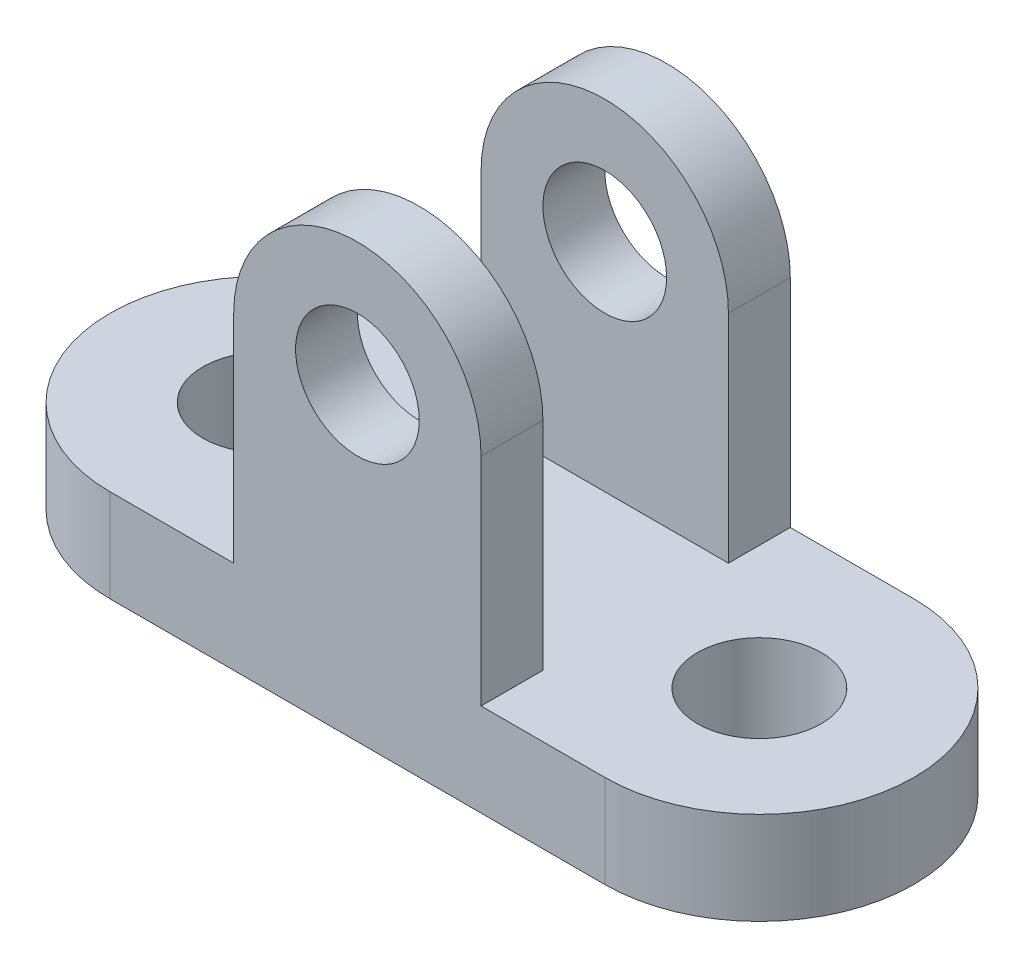
ISO-10303-21;
HEADER;
FILE_DESCRIPTION(('STEP AP214'),'2;1');
FILE_NAME('part.step','',(''),(''),'','','');
FILE_SCHEMA(('AUTOMOTIVE_DESIGN { 1 0 10303 214 1 1 1 1 }'));
ENDSEC;
DATA;
#1=APPLICATION_CONTEXT('core data for automotive mechanical design processes');
#2=APPLICATION_PROTOCOL_DEFINITION('international standard','automotive_design',2000,#1);
#3=PRODUCT_CONTEXT('',#1,'mechanical');
#4=PRODUCT('Part','Part','',(#3));
#5=PRODUCT_RELATED_PRODUCT_CATEGORY('part','',(#4));
#6=PRODUCT_DEFINITION_FORMATION('','',#4);
#7=PRODUCT_DEFINITION_CONTEXT('part definition',#1,'design');
#8=PRODUCT_DEFINITION('design','',#6,#7);
#9=PRODUCT_DEFINITION_SHAPE('','',#8);
#10=(LENGTH_UNIT() NAMED_UNIT(*) SI_UNIT(.MILLI.,.METRE.));
#11=(NAMED_UNIT(*) PLANE_ANGLE_UNIT() SI_UNIT($,.RADIAN.));
#12=(NAMED_UNIT(*) SI_UNIT($,.STERADIAN.) SOLID_ANGLE_UNIT());
#13=UNCERTAINTY_MEASURE_WITH_UNIT(LENGTH_MEASURE(1.E-05),#10,'distance_accuracy_value','');
#14=(GEOMETRIC_REPRESENTATION_CONTEXT(3) GLOBAL_UNCERTAINTY_ASSIGNED_CONTEXT((#13)) GLOBAL_UNIT_ASSIGNED_CONTEXT((#10,
#11,#12)) REPRESENTATION_CONTEXT('',''));
#15=CARTESIAN_POINT('',(0.,0.,0.));
#16=DIRECTION('',(0.,0.,1.));
#17=DIRECTION('',(1.,0.,0.));
#18=AXIS2_PLACEMENT_3D('',#15,#16,#17);
#19=CARTESIAN_POINT('',(-40.,15.,0.));
#20=DIRECTION('',(0.,1.,0.));
#21=DIRECTION('',(0.,0.,1.));
#22=AXIS2_PLACEMENT_3D('',#19,#20,#21);
#23=PLANE('',#22);
#24=DIRECTION('',(0.,0.,1.));
#25=VECTOR('',#24,1.);
#26=CARTESIAN_POINT('',(-20.,15.,-25.));
#27=LINE('',#26,#25);
#28=CARTESIAN_POINT('',(-20.,15.,-25.));
#29=VERTEX_POINT('',#28);
#30=CARTESIAN_POINT('',(-20.,15.,-15.));
#31=VERTEX_POINT('',#30);
#32=EDGE_CURVE('E141',#29,#31,#27,.T.);
#33=ORIENTED_EDGE('',*,*,#32,.F.);
#34=DIRECTION('',(-1.,0.,0.));
#35=VECTOR('',#34,1.);
#36=CARTESIAN_POINT('',(-40.,15.,-25.));
#37=LINE('',#36,#35);
#38=CARTESIAN_POINT('',(-40.,15.,-25.));
#39=VERTEX_POINT('',#38);
#40=EDGE_CURVE('E127',#29,#39,#37,.T.);
#41=ORIENTED_EDGE('',*,*,#40,.T.);
#42=CARTESIAN_POINT('',(-40.,15.,0.));
#43=DIRECTION('',(0.,1.,0.));
#44=DIRECTION('',(0.,0.,1.));
#45=AXIS2_PLACEMENT_3D('',#42,#43,#44);
#46=CIRCLE('',#45,25.);
#47=CARTESIAN_POINT('',(-40.,15.,25.));
#48=VERTEX_POINT('',#47);
#49=EDGE_CURVE('E220',#39,#48,#46,.T.);
#50=ORIENTED_EDGE('',*,*,#49,.T.);
#51=DIRECTION('',(1.,0.,0.));
#52=VECTOR('',#51,1.);
#53=CARTESIAN_POINT('',(-40.,15.,25.));
#54=LINE('',#53,#52);
#55=CARTESIAN_POINT('',(-20.,15.,25.));
#56=VERTEX_POINT('',#55);
#57=EDGE_CURVE('E224',#48,#56,#54,.T.);
#58=ORIENTED_EDGE('',*,*,#57,.T.);
#59=DIRECTION('',(0.,0.,-1.));
#60=VECTOR('',#59,1.);
#61=CARTESIAN_POINT('',(-20.,15.,25.));
#62=LINE('',#61,#60);
#63=CARTESIAN_POINT('',(-20.,15.,15.));
#64=VERTEX_POINT('',#63);
#65=EDGE_CURVE('E187',#56,#64,#62,.T.);
#66=ORIENTED_EDGE('',*,*,#65,.T.);
#67=DIRECTION('',(1.,0.,0.));
#68=VECTOR('',#67,1.);
#69=CARTESIAN_POINT('',(-20.,15.,15.));
#70=LINE('',#69,#68);
#71=CARTESIAN_POINT('',(20.,15.,15.));
#72=VERTEX_POINT('',#71);
#73=EDGE_CURVE('E177',#64,#72,#70,.T.);
#74=ORIENTED_EDGE('',*,*,#73,.T.);
#75=DIRECTION('',(0.,0.,-1.));
#76=VECTOR('',#75,1.);
#77=CARTESIAN_POINT('',(20.,15.,25.));
#78=LINE('',#77,#76);
#79=CARTESIAN_POINT('',(20.,15.,25.));
#80=VERTEX_POINT('',#79);
#81=EDGE_CURVE('E204',#80,#72,#78,.T.);
#82=ORIENTED_EDGE('',*,*,#81,.F.);
#83=CARTESIAN_POINT('',(40.,15.,25.));
#84=VERTEX_POINT('',#83);
#85=EDGE_CURVE('E222',#80,#84,#54,.T.);
#86=ORIENTED_EDGE('',*,*,#85,.T.);
#87=CARTESIAN_POINT('',(40.,15.,0.));
#88=DIRECTION('',(0.,1.,0.));
#89=DIRECTION('',(0.,0.,1.));
#90=AXIS2_PLACEMENT_3D('',#87,#88,#89);
#91=CIRCLE('',#90,25.);
#92=CARTESIAN_POINT('',(40.,15.,-25.));
#93=VERTEX_POINT('',#92);
#94=EDGE_CURVE('E139',#84,#93,#91,.T.);
#95=ORIENTED_EDGE('',*,*,#94,.T.);
#96=CARTESIAN_POINT('',(20.,15.,-25.));
#97=VERTEX_POINT('',#96);
#98=EDGE_CURVE('E138',#93,#97,#37,.T.);
#99=ORIENTED_EDGE('',*,*,#98,.T.);
#100=DIRECTION('',(0.,0.,1.));
#101=VECTOR('',#100,1.);
#102=CARTESIAN_POINT('',(20.,15.,-25.));
#103=LINE('',#102,#101);
#104=CARTESIAN_POINT('',(20.,15.,-15.));
#105=VERTEX_POINT('',#104);
#106=EDGE_CURVE('E54',#97,#105,#103,.T.);
#107=ORIENTED_EDGE('',*,*,#106,.T.);
#108=DIRECTION('',(1.,0.,0.));
#109=VECTOR('',#108,1.);
#110=CARTESIAN_POINT('',(-20.,15.,-15.));
#111=LINE('',#110,#109);
#112=EDGE_CURVE('E58',#31,#105,#111,.T.);
#113=ORIENTED_EDGE('',*,*,#112,.F.);
#114=EDGE_LOOP('',(#33,#41,#50,#58,#66,#74,#82,#86,#95,#99,#107,#113));
#115=FACE_BOUND('',#114,.T.);
#116=CARTESIAN_POINT('',(-40.,15.,0.));
#117=DIRECTION('',(0.,1.,0.));
#118=DIRECTION('',(0.,0.,1.));
#119=AXIS2_PLACEMENT_3D('',#116,#117,#118);
#120=CIRCLE('',#119,10.);
#121=CARTESIAN_POINT('',(-40.,15.,10.));
#122=VERTEX_POINT('',#121);
#123=EDGE_CURVE('E214',#122,#122,#120,.T.);
#124=ORIENTED_EDGE('',*,*,#123,.F.);
#125=EDGE_LOOP('',(#124));
#126=FACE_BOUND('',#125,.T.);
#127=CARTESIAN_POINT('',(40.,15.,0.));
#128=DIRECTION('',(0.,1.,0.));
#129=DIRECTION('',(0.,0.,1.));
#130=AXIS2_PLACEMENT_3D('',#127,#128,#129);
#131=CIRCLE('',#130,10.);
#132=CARTESIAN_POINT('',(40.,15.,9.99999999999999));
#133=VERTEX_POINT('',#132);
#134=EDGE_CURVE('E208',#133,#133,#131,.T.);
#135=ORIENTED_EDGE('',*,*,#134,.F.);
#136=EDGE_LOOP('',(#135));
#137=FACE_BOUND('',#136,.T.);
#138=ADVANCED_FACE('F39',(#115,#126,#137),#23,.T.);
#139=CARTESIAN_POINT('',(-40.,0.,0.));
#140=DIRECTION('',(0.,1.,0.));
#141=DIRECTION('',(0.,0.,1.));
#142=AXIS2_PLACEMENT_3D('',#139,#140,#141);
#143=PLANE('',#142);
#144=CARTESIAN_POINT('',(-40.,0.,0.));
#145=DIRECTION('',(0.,1.,0.));
#146=DIRECTION('',(0.,0.,1.));
#147=AXIS2_PLACEMENT_3D('',#144,#145,#146);
#148=CIRCLE('',#147,25.);
#149=CARTESIAN_POINT('',(-40.,0.,-25.));
#150=VERTEX_POINT('',#149);
#151=CARTESIAN_POINT('',(-40.,0.,25.));
#152=VERTEX_POINT('',#151);
#153=EDGE_CURVE('E217',#150,#152,#148,.T.);
#154=ORIENTED_EDGE('',*,*,#153,.F.);
#155=DIRECTION('',(-1.,0.,0.));
#156=VECTOR('',#155,1.);
#157=CARTESIAN_POINT('',(-40.,0.,-25.));
#158=LINE('',#157,#156);
#159=CARTESIAN_POINT('',(40.,0.,-25.));
#160=VERTEX_POINT('',#159);
#161=EDGE_CURVE('E223',#160,#150,#158,.T.);
#162=ORIENTED_EDGE('',*,*,#161,.F.);
#163=CARTESIAN_POINT('',(40.,0.,0.));
#164=DIRECTION('',(0.,1.,0.));
#165=DIRECTION('',(0.,0.,1.));
#166=AXIS2_PLACEMENT_3D('',#163,#164,#165);
#167=CIRCLE('',#166,25.);
#168=CARTESIAN_POINT('',(40.,0.,25.));
#169=VERTEX_POINT('',#168);
#170=EDGE_CURVE('E232',#169,#160,#167,.T.);
#171=ORIENTED_EDGE('',*,*,#170,.F.);
#172=DIRECTION('',(1.,0.,0.));
#173=VECTOR('',#172,1.);
#174=CARTESIAN_POINT('',(-40.,0.,25.));
#175=LINE('',#174,#173);
#176=EDGE_CURVE('E230',#152,#169,#175,.T.);
#177=ORIENTED_EDGE('',*,*,#176,.F.);
#178=EDGE_LOOP('',(#154,#162,#171,#177));
#179=FACE_BOUND('',#178,.T.);
#180=CARTESIAN_POINT('',(-40.,0.,0.));
#181=DIRECTION('',(0.,1.,0.));
#182=DIRECTION('',(0.,0.,1.));
#183=AXIS2_PLACEMENT_3D('',#180,#181,#182);
#184=CIRCLE('',#183,10.);
#185=CARTESIAN_POINT('',(-40.,0.,10.));
#186=VERTEX_POINT('',#185);
#187=EDGE_CURVE('E211',#186,#186,#184,.T.);
#188=ORIENTED_EDGE('',*,*,#187,.T.);
#189=EDGE_LOOP('',(#188));
#190=FACE_BOUND('',#189,.T.);
#191=CARTESIAN_POINT('',(40.,0.,0.));
#192=DIRECTION('',(0.,1.,0.));
#193=DIRECTION('',(0.,0.,1.));
#194=AXIS2_PLACEMENT_3D('',#191,#192,#193);
#195=CIRCLE('',#194,10.);
#196=CARTESIAN_POINT('',(40.,0.,9.99999999999999));
#197=VERTEX_POINT('',#196);
#198=EDGE_CURVE('E207',#197,#197,#195,.T.);
#199=ORIENTED_EDGE('',*,*,#198,.T.);
#200=EDGE_LOOP('',(#199));
#201=FACE_BOUND('',#200,.T.);
#202=ADVANCED_FACE('F250',(#179,#190,#201),#143,.F.);
#203=CARTESIAN_POINT('',(-40.,15.,0.));
#204=DIRECTION('',(0.,-1.,0.));
#205=DIRECTION('',(0.,0.,-1.));
#206=AXIS2_PLACEMENT_3D('',#203,#204,#205);
#207=CYLINDRICAL_SURFACE('',#206,25.);
#208=ORIENTED_EDGE('',*,*,#153,.T.);
#209=DIRECTION('',(0.,-1.,0.));
#210=VECTOR('',#209,1.);
#211=CARTESIAN_POINT('',(-40.,15.,25.));
#212=LINE('',#211,#210);
#213=EDGE_CURVE('E11',#48,#152,#212,.T.);
#214=ORIENTED_EDGE('',*,*,#213,.F.);
#215=ORIENTED_EDGE('',*,*,#49,.F.);
#216=DIRECTION('',(0.,-1.,0.));
#217=VECTOR('',#216,1.);
#218=CARTESIAN_POINT('',(-40.,15.,-25.));
#219=LINE('',#218,#217);
#220=EDGE_CURVE('E135',#39,#150,#219,.T.);
#221=ORIENTED_EDGE('',*,*,#220,.T.);
#222=EDGE_LOOP('',(#208,#214,#215,#221));
#223=FACE_BOUND('',#222,.T.);
#224=ADVANCED_FACE('F41',(#223),#207,.T.);
#225=CARTESIAN_POINT('',(-40.,15.,25.));
#226=DIRECTION('',(0.,0.,-1.));
#227=DIRECTION('',(-1.,0.,0.));
#228=AXIS2_PLACEMENT_3D('',#225,#226,#227);
#229=PLANE('',#228);
#230=ORIENTED_EDGE('',*,*,#176,.T.);
#231=DIRECTION('',(0.,-1.,0.));
#232=VECTOR('',#231,1.);
#233=CARTESIAN_POINT('',(40.,15.,25.));
#234=LINE('',#233,#232);
#235=EDGE_CURVE('E47',#84,#169,#234,.T.);
#236=ORIENTED_EDGE('',*,*,#235,.F.);
#237=ORIENTED_EDGE('',*,*,#85,.F.);
#238=DIRECTION('',(0.,1.,0.));
#239=VECTOR('',#238,1.);
#240=CARTESIAN_POINT('',(20.,50.,25.));
#241=LINE('',#240,#239);
#242=CARTESIAN_POINT('',(20.,50.,25.));
#243=VERTEX_POINT('',#242);
#244=EDGE_CURVE('E180',#80,#243,#241,.T.);
#245=ORIENTED_EDGE('',*,*,#244,.T.);
#246=CARTESIAN_POINT('',(0.,50.,25.));
#247=DIRECTION('',(0.,0.,1.));
#248=DIRECTION('',(-1.,0.,0.));
#249=AXIS2_PLACEMENT_3D('',#246,#247,#248);
#250=CIRCLE('',#249,20.);
#251=CARTESIAN_POINT('',(-20.,50.,25.));
#252=VERTEX_POINT('',#251);
#253=EDGE_CURVE('E182',#243,#252,#250,.T.);
#254=ORIENTED_EDGE('',*,*,#253,.T.);
#255=DIRECTION('',(0.,-1.,0.));
#256=VECTOR('',#255,1.);
#257=CARTESIAN_POINT('',(-20.,15.,25.));
#258=LINE('',#257,#256);
#259=EDGE_CURVE('E185',#252,#56,#258,.T.);
#260=ORIENTED_EDGE('',*,*,#259,.T.);
#261=ORIENTED_EDGE('',*,*,#57,.F.);
#262=ORIENTED_EDGE('',*,*,#213,.T.);
#263=EDGE_LOOP('',(#230,#236,#237,#245,#254,#260,#261,#262));
#264=FACE_BOUND('',#263,.T.);
#265=CARTESIAN_POINT('',(0.,50.,25.));
#266=DIRECTION('',(0.,0.,1.));
#267=DIRECTION('',(1.,0.,0.));
#268=AXIS2_PLACEMENT_3D('',#265,#266,#267);
#269=CIRCLE('',#268,10.);
#270=CARTESIAN_POINT('',(10.,50.,25.));
#271=VERTEX_POINT('',#270);
#272=EDGE_CURVE('E174',#271,#271,#269,.T.);
#273=ORIENTED_EDGE('',*,*,#272,.F.);
#274=EDGE_LOOP('',(#273));
#275=FACE_BOUND('',#274,.T.);
#276=ADVANCED_FACE('F256',(#264,#275),#229,.F.);
#277=CARTESIAN_POINT('',(40.,15.,0.));
#278=DIRECTION('',(0.,-1.,0.));
#279=DIRECTION('',(0.,0.,-1.));
#280=AXIS2_PLACEMENT_3D('',#277,#278,#279);
#281=CYLINDRICAL_SURFACE('',#280,25.);
#282=ORIENTED_EDGE('',*,*,#170,.T.);
#283=DIRECTION('',(0.,-1.,0.));
#284=VECTOR('',#283,1.);
#285=CARTESIAN_POINT('',(40.,15.,-25.));
#286=LINE('',#285,#284);
#287=EDGE_CURVE('E236',#93,#160,#286,.T.);
#288=ORIENTED_EDGE('',*,*,#287,.F.);
#289=ORIENTED_EDGE('',*,*,#94,.F.);
#290=ORIENTED_EDGE('',*,*,#235,.T.);
#291=EDGE_LOOP('',(#282,#288,#289,#290));
#292=FACE_BOUND('',#291,.T.);
#293=ADVANCED_FACE('F243',(#292),#281,.T.);
#294=CARTESIAN_POINT('',(-40.,15.,-25.));
#295=DIRECTION('',(0.,0.,1.));
#296=DIRECTION('',(1.,0.,0.));
#297=AXIS2_PLACEMENT_3D('',#294,#295,#296);
#298=PLANE('',#297);
#299=ORIENTED_EDGE('',*,*,#161,.T.);
#300=ORIENTED_EDGE('',*,*,#220,.F.);
#301=ORIENTED_EDGE('',*,*,#40,.F.);
#302=DIRECTION('',(0.,-1.,0.));
#303=VECTOR('',#302,1.);
#304=CARTESIAN_POINT('',(-20.,15.,-25.));
#305=LINE('',#304,#303);
#306=CARTESIAN_POINT('',(-20.,50.,-25.));
#307=VERTEX_POINT('',#306);
#308=EDGE_CURVE('E132',#307,#29,#305,.T.);
#309=ORIENTED_EDGE('',*,*,#308,.F.);
#310=CARTESIAN_POINT('',(0.,50.,-25.));
#311=DIRECTION('',(0.,0.,1.));
#312=DIRECTION('',(-1.,0.,0.));
#313=AXIS2_PLACEMENT_3D('',#310,#311,#312);
#314=CIRCLE('',#313,20.);
#315=CARTESIAN_POINT('',(20.,50.,-25.));
#316=VERTEX_POINT('',#315);
#317=EDGE_CURVE('E150',#316,#307,#314,.T.);
#318=ORIENTED_EDGE('',*,*,#317,.F.);
#319=DIRECTION('',(0.,1.,0.));
#320=VECTOR('',#319,1.);
#321=CARTESIAN_POINT('',(20.,50.,-25.));
#322=LINE('',#321,#320);
#323=EDGE_CURVE('E153',#97,#316,#322,.T.);
#324=ORIENTED_EDGE('',*,*,#323,.F.);
#325=ORIENTED_EDGE('',*,*,#98,.F.);
#326=ORIENTED_EDGE('',*,*,#287,.T.);
#327=EDGE_LOOP('',(#299,#300,#301,#309,#318,#324,#325,#326));
#328=FACE_BOUND('',#327,.T.);
#329=CARTESIAN_POINT('',(0.,50.,-25.));
#330=DIRECTION('',(0.,0.,1.));
#331=DIRECTION('',(1.,0.,0.));
#332=AXIS2_PLACEMENT_3D('',#329,#330,#331);
#333=CIRCLE('',#332,10.);
#334=CARTESIAN_POINT('',(10.,50.,-25.));
#335=VERTEX_POINT('',#334);
#336=EDGE_CURVE('E166',#335,#335,#333,.T.);
#337=ORIENTED_EDGE('',*,*,#336,.T.);
#338=EDGE_LOOP('',(#337));
#339=FACE_BOUND('',#338,.T.);
#340=ADVANCED_FACE('F128',(#328,#339),#298,.F.);
#341=CARTESIAN_POINT('',(-40.,15.,0.));
#342=DIRECTION('',(0.,-1.,0.));
#343=DIRECTION('',(0.,0.,-1.));
#344=AXIS2_PLACEMENT_3D('',#341,#342,#343);
#345=CYLINDRICAL_SURFACE('',#344,10.);
#346=ORIENTED_EDGE('',*,*,#123,.T.);
#347=EDGE_LOOP('',(#346));
#348=FACE_BOUND('',#347,.T.);
#349=ORIENTED_EDGE('',*,*,#187,.F.);
#350=EDGE_LOOP('',(#349));
#351=FACE_BOUND('',#350,.T.);
#352=ADVANCED_FACE('F292',(#348,#351),#345,.F.);
#353=CARTESIAN_POINT('',(40.,15.,0.));
#354=DIRECTION('',(0.,-1.,0.));
#355=DIRECTION('',(0.,0.,-1.));
#356=AXIS2_PLACEMENT_3D('',#353,#354,#355);
#357=CYLINDRICAL_SURFACE('',#356,10.);
#358=ORIENTED_EDGE('',*,*,#134,.T.);
#359=EDGE_LOOP('',(#358));
#360=FACE_BOUND('',#359,.T.);
#361=ORIENTED_EDGE('',*,*,#198,.F.);
#362=EDGE_LOOP('',(#361));
#363=FACE_BOUND('',#362,.T.);
#364=ADVANCED_FACE('F320',(#360,#363),#357,.F.);
#365=CARTESIAN_POINT('',(0.,50.,15.));
#366=DIRECTION('',(0.,0.,-1.));
#367=DIRECTION('',(-1.,0.,0.));
#368=AXIS2_PLACEMENT_3D('',#365,#366,#367);
#369=PLANE('',#368);
#370=ORIENTED_EDGE('',*,*,#73,.F.);
#371=DIRECTION('',(0.,-1.,0.));
#372=VECTOR('',#371,1.);
#373=CARTESIAN_POINT('',(-20.,15.,15.));
#374=LINE('',#373,#372);
#375=CARTESIAN_POINT('',(-20.,50.,15.));
#376=VERTEX_POINT('',#375);
#377=EDGE_CURVE('E183',#376,#64,#374,.T.);
#378=ORIENTED_EDGE('',*,*,#377,.F.);
#379=CARTESIAN_POINT('',(0.,50.,15.));
#380=DIRECTION('',(0.,0.,1.));
#381=DIRECTION('',(-1.,0.,0.));
#382=AXIS2_PLACEMENT_3D('',#379,#380,#381);
#383=CIRCLE('',#382,20.);
#384=CARTESIAN_POINT('',(20.,50.,15.));
#385=VERTEX_POINT('',#384);
#386=EDGE_CURVE('E192',#385,#376,#383,.T.);
#387=ORIENTED_EDGE('',*,*,#386,.F.);
#388=DIRECTION('',(0.,1.,0.));
#389=VECTOR('',#388,1.);
#390=CARTESIAN_POINT('',(20.,50.,15.));
#391=LINE('',#390,#389);
#392=EDGE_CURVE('E190',#72,#385,#391,.T.);
#393=ORIENTED_EDGE('',*,*,#392,.F.);
#394=EDGE_LOOP('',(#370,#378,#387,#393));
#395=FACE_BOUND('',#394,.T.);
#396=CARTESIAN_POINT('',(0.,50.,15.));
#397=DIRECTION('',(0.,0.,1.));
#398=DIRECTION('',(1.,0.,0.));
#399=AXIS2_PLACEMENT_3D('',#396,#397,#398);
#400=CIRCLE('',#399,10.);
#401=CARTESIAN_POINT('',(10.,50.,15.));
#402=VERTEX_POINT('',#401);
#403=EDGE_CURVE('E146',#402,#402,#400,.T.);
#404=ORIENTED_EDGE('',*,*,#403,.T.);
#405=EDGE_LOOP('',(#404));
#406=FACE_BOUND('',#405,.T.);
#407=ADVANCED_FACE('F266',(#395,#406),#369,.T.);
#408=CARTESIAN_POINT('',(20.,50.,25.));
#409=DIRECTION('',(-1.,0.,0.));
#410=DIRECTION('',(0.,-1.,0.));
#411=AXIS2_PLACEMENT_3D('',#408,#409,#410);
#412=PLANE('',#411);
#413=ORIENTED_EDGE('',*,*,#392,.T.);
#414=DIRECTION('',(0.,0.,-1.));
#415=VECTOR('',#414,1.);
#416=CARTESIAN_POINT('',(20.,50.,25.));
#417=LINE('',#416,#415);
#418=EDGE_CURVE('E201',#243,#385,#417,.T.);
#419=ORIENTED_EDGE('',*,*,#418,.F.);
#420=ORIENTED_EDGE('',*,*,#244,.F.);
#421=ORIENTED_EDGE('',*,*,#81,.T.);
#422=EDGE_LOOP('',(#413,#419,#420,#421));
#423=FACE_BOUND('',#422,.T.);
#424=ADVANCED_FACE('F271',(#423),#412,.F.);
#425=CARTESIAN_POINT('',(0.,50.,25.));
#426=DIRECTION('',(0.,0.,-1.));
#427=DIRECTION('',(-1.,0.,0.));
#428=AXIS2_PLACEMENT_3D('',#425,#426,#427);
#429=CYLINDRICAL_SURFACE('',#428,20.);
#430=ORIENTED_EDGE('',*,*,#386,.T.);
#431=DIRECTION('',(0.,0.,-1.));
#432=VECTOR('',#431,1.);
#433=CARTESIAN_POINT('',(-20.,50.,25.));
#434=LINE('',#433,#432);
#435=EDGE_CURVE('E198',#252,#376,#434,.T.);
#436=ORIENTED_EDGE('',*,*,#435,.F.);
#437=ORIENTED_EDGE('',*,*,#253,.F.);
#438=ORIENTED_EDGE('',*,*,#418,.T.);
#439=EDGE_LOOP('',(#430,#436,#437,#438));
#440=FACE_BOUND('',#439,.T.);
#441=ADVANCED_FACE('F273',(#440),#429,.T.);
#442=CARTESIAN_POINT('',(-20.,15.,25.));
#443=DIRECTION('',(1.,0.,0.));
#444=DIRECTION('',(0.,1.,0.));
#445=AXIS2_PLACEMENT_3D('',#442,#443,#444);
#446=PLANE('',#445);
#447=ORIENTED_EDGE('',*,*,#377,.T.);
#448=ORIENTED_EDGE('',*,*,#65,.F.);
#449=ORIENTED_EDGE('',*,*,#259,.F.);
#450=ORIENTED_EDGE('',*,*,#435,.T.);
#451=EDGE_LOOP('',(#447,#448,#449,#450));
#452=FACE_BOUND('',#451,.T.);
#453=ADVANCED_FACE('F262',(#452),#446,.F.);
#454=CARTESIAN_POINT('',(0.,50.,25.));
#455=DIRECTION('',(0.,0.,-1.));
#456=DIRECTION('',(-1.,0.,0.));
#457=AXIS2_PLACEMENT_3D('',#454,#455,#456);
#458=CYLINDRICAL_SURFACE('',#457,10.);
#459=ORIENTED_EDGE('',*,*,#272,.T.);
#460=EDGE_LOOP('',(#459));
#461=FACE_BOUND('',#460,.T.);
#462=ORIENTED_EDGE('',*,*,#403,.F.);
#463=EDGE_LOOP('',(#462));
#464=FACE_BOUND('',#463,.T.);
#465=ADVANCED_FACE('F280',(#461,#464),#458,.F.);
#466=CARTESIAN_POINT('',(-20.,15.,-25.));
#467=DIRECTION('',(-1.,0.,0.));
#468=DIRECTION('',(0.,-1.,0.));
#469=AXIS2_PLACEMENT_3D('',#466,#467,#468);
#470=PLANE('',#469);
#471=DIRECTION('',(0.,-1.,0.));
#472=VECTOR('',#471,1.);
#473=CARTESIAN_POINT('',(-20.,15.,-15.));
#474=LINE('',#473,#472);
#475=CARTESIAN_POINT('',(-20.,50.,-15.));
#476=VERTEX_POINT('',#475);
#477=EDGE_CURVE('E165',#476,#31,#474,.T.);
#478=ORIENTED_EDGE('',*,*,#477,.F.);
#479=DIRECTION('',(0.,0.,1.));
#480=VECTOR('',#479,1.);
#481=CARTESIAN_POINT('',(-20.,50.,-25.));
#482=LINE('',#481,#480);
#483=EDGE_CURVE('E147',#307,#476,#482,.T.);
#484=ORIENTED_EDGE('',*,*,#483,.F.);
#485=ORIENTED_EDGE('',*,*,#308,.T.);
#486=ORIENTED_EDGE('',*,*,#32,.T.);
#487=EDGE_LOOP('',(#478,#484,#485,#486));
#488=FACE_BOUND('',#487,.T.);
#489=ADVANCED_FACE('F149',(#488),#470,.T.);
#490=CARTESIAN_POINT('',(0.,50.,-25.));
#491=DIRECTION('',(0.,0.,1.));
#492=DIRECTION('',(1.,0.,0.));
#493=AXIS2_PLACEMENT_3D('',#490,#491,#492);
#494=CYLINDRICAL_SURFACE('',#493,20.);
#495=CARTESIAN_POINT('',(0.,50.,-15.));
#496=DIRECTION('',(0.,0.,1.));
#497=DIRECTION('',(-1.,0.,0.));
#498=AXIS2_PLACEMENT_3D('',#495,#496,#497);
#499=CIRCLE('',#498,20.);
#500=CARTESIAN_POINT('',(20.,50.,-15.));
#501=VERTEX_POINT('',#500);
#502=EDGE_CURVE('E156',#501,#476,#499,.T.);
#503=ORIENTED_EDGE('',*,*,#502,.F.);
#504=DIRECTION('',(0.,0.,1.));
#505=VECTOR('',#504,1.);
#506=CARTESIAN_POINT('',(20.,50.,-25.));
#507=LINE('',#506,#505);
#508=EDGE_CURVE('E171',#316,#501,#507,.T.);
#509=ORIENTED_EDGE('',*,*,#508,.F.);
#510=ORIENTED_EDGE('',*,*,#317,.T.);
#511=ORIENTED_EDGE('',*,*,#483,.T.);
#512=EDGE_LOOP('',(#503,#509,#510,#511));
#513=FACE_BOUND('',#512,.T.);
#514=ADVANCED_FACE('F381',(#513),#494,.T.);
#515=CARTESIAN_POINT('',(20.,50.,-25.));
#516=DIRECTION('',(1.,0.,0.));
#517=DIRECTION('',(0.,1.,0.));
#518=AXIS2_PLACEMENT_3D('',#515,#516,#517);
#519=PLANE('',#518);
#520=DIRECTION('',(0.,1.,0.));
#521=VECTOR('',#520,1.);
#522=CARTESIAN_POINT('',(20.,50.,-15.));
#523=LINE('',#522,#521);
#524=EDGE_CURVE('E151',#105,#501,#523,.T.);
#525=ORIENTED_EDGE('',*,*,#524,.F.);
#526=ORIENTED_EDGE('',*,*,#106,.F.);
#527=ORIENTED_EDGE('',*,*,#323,.T.);
#528=ORIENTED_EDGE('',*,*,#508,.T.);
#529=EDGE_LOOP('',(#525,#526,#527,#528));
#530=FACE_BOUND('',#529,.T.);
#531=ADVANCED_FACE('F390',(#530),#519,.T.);
#532=CARTESIAN_POINT('',(0.,50.,-15.));
#533=DIRECTION('',(0.,0.,1.));
#534=DIRECTION('',(-1.,0.,0.));
#535=AXIS2_PLACEMENT_3D('',#532,#533,#534);
#536=PLANE('',#535);
#537=CARTESIAN_POINT('',(0.,50.,-15.));
#538=DIRECTION('',(0.,0.,1.));
#539=DIRECTION('',(1.,0.,0.));
#540=AXIS2_PLACEMENT_3D('',#537,#538,#539);
#541=CIRCLE('',#540,10.);
#542=CARTESIAN_POINT('',(10.,50.,-15.));
#543=VERTEX_POINT('',#542);
#544=EDGE_CURVE('E159',#543,#543,#541,.T.);
#545=ORIENTED_EDGE('',*,*,#544,.F.);
#546=EDGE_LOOP('',(#545));
#547=FACE_BOUND('',#546,.T.);
#548=ORIENTED_EDGE('',*,*,#112,.T.);
#549=ORIENTED_EDGE('',*,*,#524,.T.);
#550=ORIENTED_EDGE('',*,*,#502,.T.);
#551=ORIENTED_EDGE('',*,*,#477,.T.);
#552=EDGE_LOOP('',(#548,#549,#550,#551));
#553=FACE_BOUND('',#552,.T.);
#554=ADVANCED_FACE('F400',(#547,#553),#536,.T.);
#555=CARTESIAN_POINT('',(0.,50.,-25.));
#556=DIRECTION('',(0.,0.,1.));
#557=DIRECTION('',(1.,0.,0.));
#558=AXIS2_PLACEMENT_3D('',#555,#556,#557);
#559=CYLINDRICAL_SURFACE('',#558,10.);
#560=ORIENTED_EDGE('',*,*,#336,.F.);
#561=EDGE_LOOP('',(#560));
#562=FACE_BOUND('',#561,.T.);
#563=ORIENTED_EDGE('',*,*,#544,.T.);
#564=EDGE_LOOP('',(#563));
#565=FACE_BOUND('',#564,.T.);
#566=ADVANCED_FACE('F410',(#562,#565),#559,.F.);
#567=CLOSED_SHELL('',(#138,#202,#224,#276,#293,#340,#352,#364,#407,#424,#441,#453,#465,#489,
#514,#531,#554,#566));
#568=MANIFOLD_SOLID_BREP('B2',#567);
#569=ADVANCED_BREP_SHAPE_REPRESENTATION('',(#18,#568),#14);
#570=SHAPE_DEFINITION_REPRESENTATION(#9,#569);
ENDSEC;
END-ISO-10303-21;
